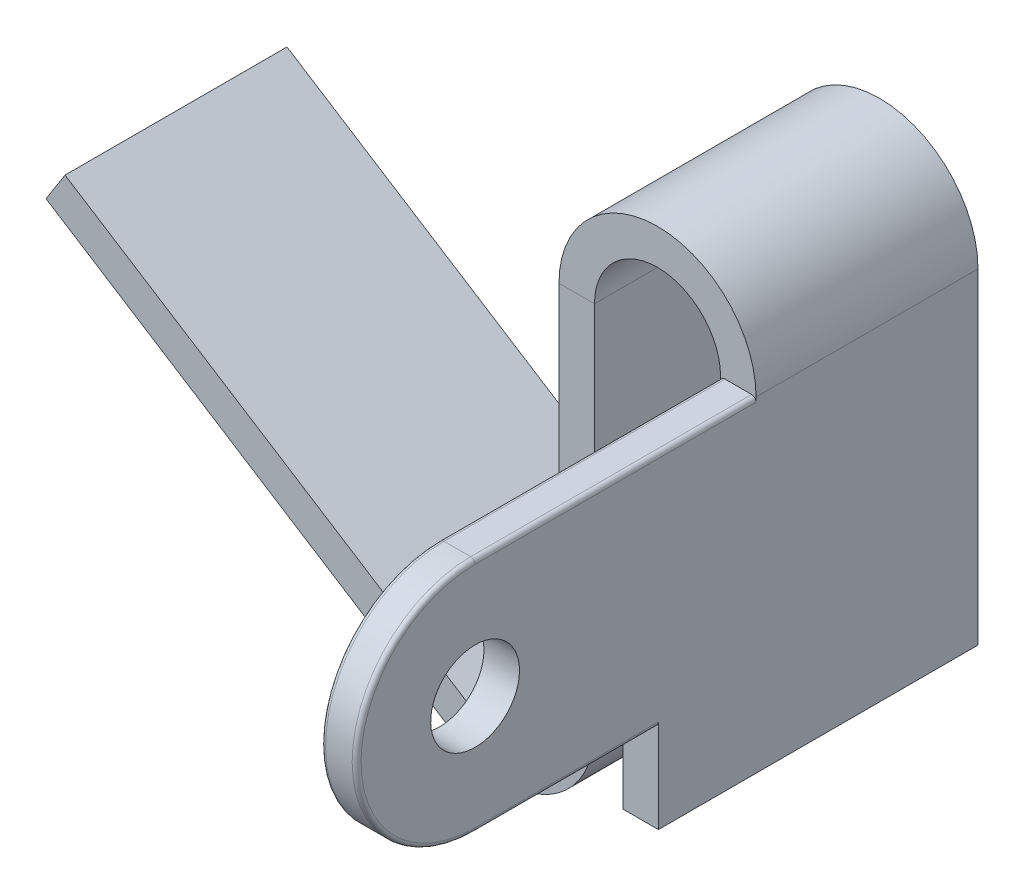
ISO-10303-21;
HEADER;
FILE_DESCRIPTION(('STEP AP214'),'2;1');
FILE_NAME('part.step','',(''),(''),'','','');
FILE_SCHEMA(('AUTOMOTIVE_DESIGN { 1 0 10303 214 1 1 1 1 }'));
ENDSEC;
DATA;
#1=APPLICATION_CONTEXT('core data for automotive mechanical design processes');
#2=APPLICATION_PROTOCOL_DEFINITION('international standard','automotive_design',2000,#1);
#3=PRODUCT_CONTEXT('',#1,'mechanical');
#4=PRODUCT('Part','Part','',(#3));
#5=PRODUCT_RELATED_PRODUCT_CATEGORY('part','',(#4));
#6=PRODUCT_DEFINITION_FORMATION('','',#4);
#7=PRODUCT_DEFINITION_CONTEXT('part definition',#1,'design');
#8=PRODUCT_DEFINITION('design','',#6,#7);
#9=PRODUCT_DEFINITION_SHAPE('','',#8);
#10=(LENGTH_UNIT() NAMED_UNIT(*) SI_UNIT(.MILLI.,.METRE.));
#11=(NAMED_UNIT(*) PLANE_ANGLE_UNIT() SI_UNIT($,.RADIAN.));
#12=(NAMED_UNIT(*) SI_UNIT($,.STERADIAN.) SOLID_ANGLE_UNIT());
#13=UNCERTAINTY_MEASURE_WITH_UNIT(LENGTH_MEASURE(1.E-05),#10,'distance_accuracy_value','');
#14=(GEOMETRIC_REPRESENTATION_CONTEXT(3) GLOBAL_UNCERTAINTY_ASSIGNED_CONTEXT((#13)) GLOBAL_UNIT_ASSIGNED_CONTEXT((#10,
#11,#12)) REPRESENTATION_CONTEXT('',''));
#15=CARTESIAN_POINT('',(0.,0.,0.));
#16=DIRECTION('',(0.,0.,1.));
#17=DIRECTION('',(1.,0.,0.));
#18=AXIS2_PLACEMENT_3D('',#15,#16,#17);
#19=CARTESIAN_POINT('',(-0.0766485027156681,0.0732980143033362,3.5723853161025));
#20=DIRECTION('',(1.,0.,0.));
#21=DIRECTION('',(0.,1.,0.));
#22=AXIS2_PLACEMENT_3D('',#19,#20,#21);
#23=CYLINDRICAL_SURFACE('',#22,0.594075);
#24=DIRECTION('',(-1.,0.,0.));
#25=VECTOR('',#24,1.);
#26=CARTESIAN_POINT('',(-0.254648502715668,-0.520776985696664,3.5723853161025));
#27=LINE('',#26,#25);
#28=CARTESIAN_POINT('',(-0.0988985027156681,-0.520776985696664,3.5723853161025));
#29=VERTEX_POINT('',#28);
#30=CARTESIAN_POINT('',(-0.232398502715668,-0.520776985696664,3.5723853161025));
#31=VERTEX_POINT('',#30);
#32=EDGE_CURVE('E245',#29,#31,#27,.T.);
#33=ORIENTED_EDGE('',*,*,#32,.F.);
#34=CARTESIAN_POINT('',(-0.0988985027156681,0.0732980143033362,3.5723853161025));
#35=DIRECTION('',(-1.,0.,0.));
#36=DIRECTION('',(0.,-1.,0.));
#37=AXIS2_PLACEMENT_3D('',#34,#35,#36);
#38=CIRCLE('',#37,0.594075);
#39=CARTESIAN_POINT('',(-0.0988985027156681,0.667373014303336,3.5723853161025));
#40=VERTEX_POINT('',#39);
#41=EDGE_CURVE('E278',#29,#40,#38,.T.);
#42=ORIENTED_EDGE('',*,*,#41,.T.);
#43=DIRECTION('',(-1.,0.,0.));
#44=VECTOR('',#43,1.);
#45=CARTESIAN_POINT('',(-0.0766485027156681,0.667373014303336,3.5723853161025));
#46=LINE('',#45,#44);
#47=CARTESIAN_POINT('',(-0.232398502715668,0.667373014303336,3.5723853161025));
#48=VERTEX_POINT('',#47);
#49=EDGE_CURVE('E248',#48,#40,#46,.F.);
#50=ORIENTED_EDGE('',*,*,#49,.F.);
#51=CARTESIAN_POINT('',(-0.232398502715668,0.0732980143033362,3.5723853161025));
#52=DIRECTION('',(-1.,0.,0.));
#53=DIRECTION('',(0.,-1.,0.));
#54=AXIS2_PLACEMENT_3D('',#51,#52,#53);
#55=CIRCLE('',#54,0.594075);
#56=EDGE_CURVE('E276',#48,#31,#55,.F.);
#57=ORIENTED_EDGE('',*,*,#56,.T.);
#58=EDGE_LOOP('',(#33,#42,#50,#57));
#59=FACE_BOUND('',#58,.T.);
#60=ADVANCED_FACE('F42',(#59),#23,.T.);
#61=CARTESIAN_POINT('',(-0.254648502715668,-0.965776985696664,2.1639603161025));
#62=DIRECTION('',(-1.,0.,0.));
#63=DIRECTION('',(0.,-1.,0.));
#64=AXIS2_PLACEMENT_3D('',#61,#62,#63);
#65=PLANE('',#64);
#66=CARTESIAN_POINT('',(-0.254648502715668,0.0732980143033362,3.5723853161025));
#67=DIRECTION('',(-1.,0.,0.));
#68=DIRECTION('',(0.,-1.,0.));
#69=AXIS2_PLACEMENT_3D('',#66,#67,#68);
#70=CIRCLE('',#69,0.2225);
#71=CARTESIAN_POINT('',(-0.254648502715668,-0.149201985696664,3.5723853161025));
#72=VERTEX_POINT('',#71);
#73=EDGE_CURVE('E299',#72,#72,#70,.F.);
#74=ORIENTED_EDGE('',*,*,#73,.T.);
#75=EDGE_LOOP('',(#74));
#76=FACE_BOUND('',#75,.T.);
#77=DIRECTION('',(0.,0.,-1.));
#78=VECTOR('',#77,1.);
#79=CARTESIAN_POINT('',(-0.254648502715668,0.645123014303336,2.1639603161025));
#80=LINE('',#79,#78);
#81=CARTESIAN_POINT('',(-0.254648502715668,0.645123014303336,3.5723853161025));
#82=VERTEX_POINT('',#81);
#83=CARTESIAN_POINT('',(-0.254648502715668,0.645123014303336,2.1639603161025));
#84=VERTEX_POINT('',#83);
#85=EDGE_CURVE('E269',#82,#84,#80,.T.);
#86=ORIENTED_EDGE('',*,*,#85,.T.);
#87=DIRECTION('',(0.,1.,0.));
#88=VECTOR('',#87,1.);
#89=CARTESIAN_POINT('',(-0.254648502715668,-0.965776985696664,2.1639603161025));
#90=LINE('',#89,#88);
#91=CARTESIAN_POINT('',(-0.254648502715668,0.667373014303336,2.1639603161025));
#92=VERTEX_POINT('',#91);
#93=EDGE_CURVE('E274',#84,#92,#90,.T.);
#94=ORIENTED_EDGE('',*,*,#93,.T.);
#95=DIRECTION('',(0.,0.,-1.));
#96=VECTOR('',#95,1.);
#97=CARTESIAN_POINT('',(-0.254648502715668,0.667373014303336,2.1639603161025));
#98=LINE('',#97,#96);
#99=CARTESIAN_POINT('',(-0.254648502715668,0.667373014303336,1.0514603161025));
#100=VERTEX_POINT('',#99);
#101=EDGE_CURVE('E206',#92,#100,#98,.T.);
#102=ORIENTED_EDGE('',*,*,#101,.T.);
#103=DIRECTION('',(0.,1.,0.));
#104=VECTOR('',#103,1.);
#105=CARTESIAN_POINT('',(-0.254648502715668,-0.965776985696664,1.0514603161025));
#106=LINE('',#105,#104);
#107=CARTESIAN_POINT('',(-0.254648502715668,-0.965776985696664,1.0514603161025));
#108=VERTEX_POINT('',#107);
#109=EDGE_CURVE('E354',#108,#100,#106,.T.);
#110=ORIENTED_EDGE('',*,*,#109,.F.);
#111=DIRECTION('',(0.,0.,-1.));
#112=VECTOR('',#111,1.);
#113=CARTESIAN_POINT('',(-0.254648502715668,-0.965776985696664,2.1639603161025));
#114=LINE('',#113,#112);
#115=CARTESIAN_POINT('',(-0.254648502715668,-0.965776985696664,2.6534603161025));
#116=VERTEX_POINT('',#115);
#117=EDGE_CURVE('E203',#116,#108,#114,.T.);
#118=ORIENTED_EDGE('',*,*,#117,.F.);
#119=DIRECTION('',(0.,-1.,0.));
#120=VECTOR('',#119,1.);
#121=CARTESIAN_POINT('',(-0.254648502715668,-0.965776985696664,2.6534603161025));
#122=LINE('',#121,#120);
#123=CARTESIAN_POINT('',(-0.254648502715668,-0.498526985696664,2.6534603161025));
#124=VERTEX_POINT('',#123);
#125=EDGE_CURVE('E67',#124,#116,#122,.T.);
#126=ORIENTED_EDGE('',*,*,#125,.F.);
#127=DIRECTION('',(0.,0.,1.));
#128=VECTOR('',#127,1.);
#129=CARTESIAN_POINT('',(-0.254648502715668,-0.498526985696664,2.1639603161025));
#130=LINE('',#129,#128);
#131=CARTESIAN_POINT('',(-0.254648502715668,-0.498526985696664,3.5723853161025));
#132=VERTEX_POINT('',#131);
#133=EDGE_CURVE('E272',#124,#132,#130,.T.);
#134=ORIENTED_EDGE('',*,*,#133,.T.);
#135=CARTESIAN_POINT('',(-0.254648502715668,0.0732980143033362,3.5723853161025));
#136=DIRECTION('',(-1.,0.,0.));
#137=DIRECTION('',(0.,-1.,0.));
#138=AXIS2_PLACEMENT_3D('',#135,#136,#137);
#139=CIRCLE('',#138,0.571825);
#140=EDGE_CURVE('E267',#132,#82,#139,.T.);
#141=ORIENTED_EDGE('',*,*,#140,.T.);
#142=EDGE_LOOP('',(#86,#94,#102,#110,#118,#126,#134,#141));
#143=FACE_BOUND('',#142,.T.);
#144=ADVANCED_FACE('F433',(#76,#143),#65,.T.);
#145=CARTESIAN_POINT('',(-0.0766485027156681,-0.965776985696664,2.1639603161025));
#146=DIRECTION('',(0.,-1.,0.));
#147=DIRECTION('',(0.,0.,-1.));
#148=AXIS2_PLACEMENT_3D('',#145,#146,#147);
#149=PLANE('',#148);
#150=DIRECTION('',(0.,0.,-1.));
#151=VECTOR('',#150,1.);
#152=CARTESIAN_POINT('',(-0.0766485027156681,-0.965776985696664,2.1639603161025));
#153=LINE('',#152,#151);
#154=CARTESIAN_POINT('',(-0.0766485027156681,-0.965776985696664,2.6534603161025));
#155=VERTEX_POINT('',#154);
#156=CARTESIAN_POINT('',(-0.0766485027156681,-0.965776985696664,1.0514603161025));
#157=VERTEX_POINT('',#156);
#158=EDGE_CURVE('E193',#155,#157,#153,.T.);
#159=ORIENTED_EDGE('',*,*,#158,.F.);
#160=DIRECTION('',(-1.,0.,0.));
#161=VECTOR('',#160,1.);
#162=CARTESIAN_POINT('',(-0.254648502715668,-0.965776985696664,2.6534603161025));
#163=LINE('',#162,#161);
#164=EDGE_CURVE('E180',#116,#155,#163,.F.);
#165=ORIENTED_EDGE('',*,*,#164,.F.);
#166=ORIENTED_EDGE('',*,*,#117,.T.);
#167=DIRECTION('',(-1.,0.,0.));
#168=VECTOR('',#167,1.);
#169=CARTESIAN_POINT('',(-0.0766485027156681,-0.965776985696664,1.0514603161025));
#170=LINE('',#169,#168);
#171=EDGE_CURVE('E202',#157,#108,#170,.T.);
#172=ORIENTED_EDGE('',*,*,#171,.F.);
#173=EDGE_LOOP('',(#159,#165,#166,#172));
#174=FACE_BOUND('',#173,.T.);
#175=ADVANCED_FACE('F200',(#174),#149,.T.);
#176=CARTESIAN_POINT('',(-0.0766485027156681,-0.965776985696664,2.1639603161025));
#177=DIRECTION('',(-1.,0.,0.));
#178=DIRECTION('',(0.,-1.,0.));
#179=AXIS2_PLACEMENT_3D('',#176,#177,#178);
#180=PLANE('',#179);
#181=CARTESIAN_POINT('',(-0.0766485027156681,0.0732980143033362,3.5723853161025));
#182=DIRECTION('',(1.,0.,0.));
#183=DIRECTION('',(0.,1.,0.));
#184=AXIS2_PLACEMENT_3D('',#181,#182,#183);
#185=CIRCLE('',#184,0.2225);
#186=CARTESIAN_POINT('',(-0.0766485027156681,0.295798014303337,3.5723853161025));
#187=VERTEX_POINT('',#186);
#188=EDGE_CURVE('E292',#187,#187,#185,.T.);
#189=ORIENTED_EDGE('',*,*,#188,.F.);
#190=EDGE_LOOP('',(#189));
#191=FACE_BOUND('',#190,.T.);
#192=DIRECTION('',(0.,0.,1.));
#193=VECTOR('',#192,1.);
#194=CARTESIAN_POINT('',(-0.0766485027156681,-0.498526985696664,2.6534603161025));
#195=LINE('',#194,#193);
#196=CARTESIAN_POINT('',(-0.0766485027156681,-0.498526985696664,3.5723853161025));
#197=VERTEX_POINT('',#196);
#198=CARTESIAN_POINT('',(-0.0766485027156681,-0.498526985696664,2.6534603161025));
#199=VERTEX_POINT('',#198);
#200=EDGE_CURVE('E196',#197,#199,#195,.F.);
#201=ORIENTED_EDGE('',*,*,#200,.T.);
#202=DIRECTION('',(0.,-1.,0.));
#203=VECTOR('',#202,1.);
#204=CARTESIAN_POINT('',(-0.0766485027156681,-0.965776985696664,2.6534603161025));
#205=LINE('',#204,#203);
#206=EDGE_CURVE('E184',#199,#155,#205,.T.);
#207=ORIENTED_EDGE('',*,*,#206,.T.);
#208=ORIENTED_EDGE('',*,*,#158,.T.);
#209=DIRECTION('',(0.,1.,0.));
#210=VECTOR('',#209,1.);
#211=CARTESIAN_POINT('',(-0.0766485027156681,-0.965776985696664,1.0514603161025));
#212=LINE('',#211,#210);
#213=CARTESIAN_POINT('',(-0.0766485027156682,0.667373014303336,1.0514603161025));
#214=VERTEX_POINT('',#213);
#215=EDGE_CURVE('E358',#157,#214,#212,.T.);
#216=ORIENTED_EDGE('',*,*,#215,.T.);
#217=DIRECTION('',(0.,0.,-1.));
#218=VECTOR('',#217,1.);
#219=CARTESIAN_POINT('',(-0.0766485027156682,0.667373014303336,2.1639603161025));
#220=LINE('',#219,#218);
#221=CARTESIAN_POINT('',(-0.0766485027156682,0.667373014303336,2.1639603161025));
#222=VERTEX_POINT('',#221);
#223=EDGE_CURVE('E204',#222,#214,#220,.T.);
#224=ORIENTED_EDGE('',*,*,#223,.F.);
#225=DIRECTION('',(0.,-1.,0.));
#226=VECTOR('',#225,1.);
#227=CARTESIAN_POINT('',(-0.0766485027156682,0.667373014303336,2.1639603161025));
#228=LINE('',#227,#226);
#229=CARTESIAN_POINT('',(-0.0766485027156681,0.645123014303336,2.1639603161025));
#230=VERTEX_POINT('',#229);
#231=EDGE_CURVE('E59',#222,#230,#228,.T.);
#232=ORIENTED_EDGE('',*,*,#231,.T.);
#233=DIRECTION('',(0.,0.,-1.));
#234=VECTOR('',#233,1.);
#235=CARTESIAN_POINT('',(-0.0766485027156681,0.645123014303336,2.1639603161025));
#236=LINE('',#235,#234);
#237=CARTESIAN_POINT('',(-0.0766485027156681,0.645123014303336,3.5723853161025));
#238=VERTEX_POINT('',#237);
#239=EDGE_CURVE('E259',#230,#238,#236,.F.);
#240=ORIENTED_EDGE('',*,*,#239,.T.);
#241=CARTESIAN_POINT('',(-0.0766485027156681,0.0732980143033362,3.5723853161025));
#242=DIRECTION('',(-1.,0.,0.));
#243=DIRECTION('',(0.,-1.,0.));
#244=AXIS2_PLACEMENT_3D('',#241,#242,#243);
#245=CIRCLE('',#244,0.571825);
#246=EDGE_CURVE('E256',#238,#197,#245,.F.);
#247=ORIENTED_EDGE('',*,*,#246,.T.);
#248=EDGE_LOOP('',(#201,#207,#208,#216,#224,#232,#240,#247));
#249=FACE_BOUND('',#248,.T.);
#250=ADVANCED_FACE('F191',(#191,#249),#180,.F.);
#251=CARTESIAN_POINT('',(-0.886548502715667,0.667373014303336,2.1639603161025));
#252=DIRECTION('',(0.,0.,1.));
#253=DIRECTION('',(1.,0.,0.));
#254=AXIS2_PLACEMENT_3D('',#251,#252,#253);
#255=PLANE('',#254);
#256=DIRECTION('',(-1.,0.,0.));
#257=VECTOR('',#256,1.);
#258=CARTESIAN_POINT('',(-0.886548502715667,0.667373014303336,2.1639603161025));
#259=LINE('',#258,#257);
#260=CARTESIAN_POINT('',(-0.886548502715667,0.667373014303336,2.1639603161025));
#261=VERTEX_POINT('',#260);
#262=CARTESIAN_POINT('',(-1.06454850271567,0.667373014303336,2.1639603161025));
#263=VERTEX_POINT('',#262);
#264=EDGE_CURVE('E243',#261,#263,#259,.T.);
#265=ORIENTED_EDGE('',*,*,#264,.F.);
#266=CARTESIAN_POINT('',(-0.570598502715668,0.667373014303336,2.1639603161025));
#267=DIRECTION('',(0.,0.,1.));
#268=DIRECTION('',(1.,0.,0.));
#269=AXIS2_PLACEMENT_3D('',#266,#267,#268);
#270=CIRCLE('',#269,0.31595);
#271=EDGE_CURVE('E325',#92,#261,#270,.T.);
#272=ORIENTED_EDGE('',*,*,#271,.F.);
#273=ORIENTED_EDGE('',*,*,#93,.F.);
#274=CARTESIAN_POINT('',(-0.232398502715668,0.645123014303336,2.1639603161025));
#275=DIRECTION('',(0.,0.,1.));
#276=DIRECTION('',(1.,0.,0.));
#277=AXIS2_PLACEMENT_3D('',#274,#275,#276);
#278=CIRCLE('',#277,0.02225);
#279=CARTESIAN_POINT('',(-0.232398502715668,0.667373014303336,2.1639603161025));
#280=VERTEX_POINT('',#279);
#281=EDGE_CURVE('E11',#84,#280,#278,.F.);
#282=ORIENTED_EDGE('',*,*,#281,.T.);
#283=DIRECTION('',(-1.,0.,0.));
#284=VECTOR('',#283,1.);
#285=CARTESIAN_POINT('',(-0.0766485027156682,0.667373014303336,2.1639603161025));
#286=LINE('',#285,#284);
#287=CARTESIAN_POINT('',(-0.0988985027156681,0.667373014303336,2.1639603161025));
#288=VERTEX_POINT('',#287);
#289=EDGE_CURVE('E240',#288,#280,#286,.T.);
#290=ORIENTED_EDGE('',*,*,#289,.F.);
#291=CARTESIAN_POINT('',(-0.0988985027156681,0.645123014303336,2.1639603161025));
#292=DIRECTION('',(0.,0.,1.));
#293=DIRECTION('',(1.,0.,0.));
#294=AXIS2_PLACEMENT_3D('',#291,#292,#293);
#295=CIRCLE('',#294,0.02225);
#296=EDGE_CURVE('E280',#288,#230,#295,.F.);
#297=ORIENTED_EDGE('',*,*,#296,.T.);
#298=ORIENTED_EDGE('',*,*,#231,.F.);
#299=CARTESIAN_POINT('',(-0.570598502715668,0.667373014303336,2.1639603161025));
#300=DIRECTION('',(0.,0.,1.));
#301=DIRECTION('',(1.,0.,0.));
#302=AXIS2_PLACEMENT_3D('',#299,#300,#301);
#303=CIRCLE('',#302,0.49395);
#304=EDGE_CURVE('E328',#222,#263,#303,.T.);
#305=ORIENTED_EDGE('',*,*,#304,.T.);
#306=EDGE_LOOP('',(#265,#272,#273,#282,#290,#297,#298,#305));
#307=FACE_BOUND('',#306,.T.);
#308=ADVANCED_FACE('F421',(#307),#255,.T.);
#309=CARTESIAN_POINT('',(-0.0766485027156682,0.667373014303336,2.1639603161025));
#310=DIRECTION('',(0.,0.,1.));
#311=DIRECTION('',(1.,0.,0.));
#312=AXIS2_PLACEMENT_3D('',#309,#310,#311);
#313=PLANE('',#312);
#314=DIRECTION('',(0.,-1.,0.));
#315=VECTOR('',#314,1.);
#316=CARTESIAN_POINT('',(-0.886548502715667,0.667373014303336,2.1639603161025));
#317=LINE('',#316,#315);
#318=CARTESIAN_POINT('',(-0.886548502715667,-1.18827698569666,2.1639603161025));
#319=VERTEX_POINT('',#318);
#320=EDGE_CURVE('E322',#261,#319,#317,.T.);
#321=ORIENTED_EDGE('',*,*,#320,.F.);
#322=ORIENTED_EDGE('',*,*,#264,.T.);
#323=DIRECTION('',(0.,-1.,0.));
#324=VECTOR('',#323,1.);
#325=CARTESIAN_POINT('',(-1.06454850271567,0.667373014303336,2.1639603161025));
#326=LINE('',#325,#324);
#327=CARTESIAN_POINT('',(-1.06454850271567,-1.18827698569666,2.1639603161025));
#328=VERTEX_POINT('',#327);
#329=EDGE_CURVE('E330',#263,#328,#326,.T.);
#330=ORIENTED_EDGE('',*,*,#329,.T.);
#331=DIRECTION('',(1.,0.,0.));
#332=VECTOR('',#331,1.);
#333=CARTESIAN_POINT('',(-1.06454850271567,-1.18827698569666,2.1639603161025));
#334=LINE('',#333,#332);
#335=EDGE_CURVE('E232',#328,#319,#334,.T.);
#336=ORIENTED_EDGE('',*,*,#335,.T.);
#337=EDGE_LOOP('',(#321,#322,#330,#336));
#338=FACE_BOUND('',#337,.T.);
#339=ADVANCED_FACE('F419',(#338),#313,.T.);
#340=CARTESIAN_POINT('',(-0.254648502715668,0.667373014303336,1.0514603161025));
#341=DIRECTION('',(0.,0.,-1.));
#342=DIRECTION('',(-1.,0.,0.));
#343=AXIS2_PLACEMENT_3D('',#340,#341,#342);
#344=PLANE('',#343);
#345=DIRECTION('',(1.,0.,0.));
#346=VECTOR('',#345,1.);
#347=CARTESIAN_POINT('',(-0.254648502715668,0.667373014303336,1.0514603161025));
#348=LINE('',#347,#346);
#349=EDGE_CURVE('E238',#100,#214,#348,.T.);
#350=ORIENTED_EDGE('',*,*,#349,.F.);
#351=CARTESIAN_POINT('',(-0.570598502715668,0.667373014303336,1.0514603161025));
#352=DIRECTION('',(0.,0.,1.));
#353=DIRECTION('',(1.,0.,0.));
#354=AXIS2_PLACEMENT_3D('',#351,#352,#353);
#355=CIRCLE('',#354,0.31595);
#356=CARTESIAN_POINT('',(-0.886548502715667,0.667373014303336,1.0514603161025));
#357=VERTEX_POINT('',#356);
#358=EDGE_CURVE('E351',#100,#357,#355,.T.);
#359=ORIENTED_EDGE('',*,*,#358,.T.);
#360=DIRECTION('',(1.,0.,0.));
#361=VECTOR('',#360,1.);
#362=CARTESIAN_POINT('',(-1.06454850271567,0.667373014303336,1.0514603161025));
#363=LINE('',#362,#361);
#364=CARTESIAN_POINT('',(-1.06454850271567,0.667373014303336,1.0514603161025));
#365=VERTEX_POINT('',#364);
#366=EDGE_CURVE('E236',#365,#357,#363,.T.);
#367=ORIENTED_EDGE('',*,*,#366,.F.);
#368=CARTESIAN_POINT('',(-0.570598502715668,0.667373014303336,1.0514603161025));
#369=DIRECTION('',(0.,0.,1.));
#370=DIRECTION('',(1.,0.,0.));
#371=AXIS2_PLACEMENT_3D('',#368,#369,#370);
#372=CIRCLE('',#371,0.49395);
#373=EDGE_CURVE('E360',#214,#365,#372,.T.);
#374=ORIENTED_EDGE('',*,*,#373,.F.);
#375=EDGE_LOOP('',(#350,#359,#367,#374));
#376=FACE_BOUND('',#375,.T.);
#377=ADVANCED_FACE('F425',(#376),#344,.T.);
#378=CARTESIAN_POINT('',(-1.06454850271567,0.667373014303336,1.0514603161025));
#379=DIRECTION('',(0.,0.,-1.));
#380=DIRECTION('',(-1.,0.,0.));
#381=AXIS2_PLACEMENT_3D('',#378,#379,#380);
#382=PLANE('',#381);
#383=ORIENTED_EDGE('',*,*,#109,.T.);
#384=ORIENTED_EDGE('',*,*,#349,.T.);
#385=ORIENTED_EDGE('',*,*,#215,.F.);
#386=ORIENTED_EDGE('',*,*,#171,.T.);
#387=EDGE_LOOP('',(#383,#384,#385,#386));
#388=FACE_BOUND('',#387,.T.);
#389=ADVANCED_FACE('F432',(#388),#382,.T.);
#390=CARTESIAN_POINT('',(-1.57018812342235,-1.56387801262413,2.1639603161025));
#391=DIRECTION('',(0.,0.,1.));
#392=DIRECTION('',(1.,0.,0.));
#393=AXIS2_PLACEMENT_3D('',#390,#391,#392);
#394=PLANE('',#393);
#395=DIRECTION('',(0.536268810576818,0.844047251522404,0.));
#396=VECTOR('',#395,1.);
#397=CARTESIAN_POINT('',(-1.57018812342235,-1.56387801262413,2.1639603161025));
#398=LINE('',#397,#396);
#399=CARTESIAN_POINT('',(-1.57018812342235,-1.56387801262413,2.1639603161025));
#400=VERTEX_POINT('',#399);
#401=CARTESIAN_POINT('',(-1.47473227513968,-1.41363760185315,2.1639603161025));
#402=VERTEX_POINT('',#401);
#403=EDGE_CURVE('E234',#400,#402,#398,.T.);
#404=ORIENTED_EDGE('',*,*,#403,.F.);
#405=CARTESIAN_POINT('',(-1.33154850271567,-1.18827698569666,2.1639603161025));
#406=DIRECTION('',(0.,0.,-1.));
#407=DIRECTION('',(-1.,0.,0.));
#408=AXIS2_PLACEMENT_3D('',#405,#406,#407);
#409=CIRCLE('',#408,0.445);
#410=EDGE_CURVE('E319',#319,#400,#409,.T.);
#411=ORIENTED_EDGE('',*,*,#410,.F.);
#412=ORIENTED_EDGE('',*,*,#335,.F.);
#413=CARTESIAN_POINT('',(-1.33154850271567,-1.18827698569666,2.1639603161025));
#414=DIRECTION('',(0.,0.,1.));
#415=DIRECTION('',(1.,0.,0.));
#416=AXIS2_PLACEMENT_3D('',#413,#414,#415);
#417=CIRCLE('',#416,0.267);
#418=EDGE_CURVE('E333',#328,#402,#417,.F.);
#419=ORIENTED_EDGE('',*,*,#418,.T.);
#420=EDGE_LOOP('',(#404,#411,#412,#419));
#421=FACE_BOUND('',#420,.T.);
#422=ADVANCED_FACE('F417',(#421),#394,.T.);
#423=CARTESIAN_POINT('',(-1.06454850271567,-1.18827698569666,2.1639603161025));
#424=DIRECTION('',(0.,0.,1.));
#425=DIRECTION('',(1.,0.,0.));
#426=AXIS2_PLACEMENT_3D('',#423,#424,#425);
#427=PLANE('',#426);
#428=DIRECTION('',(-0.844047251522404,0.536268810576819,0.));
#429=VECTOR('',#428,1.);
#430=CARTESIAN_POINT('',(-1.57018812342235,-1.56387801262413,2.1639603161025));
#431=LINE('',#430,#429);
#432=CARTESIAN_POINT('',(-3.63599377152343,-0.251360098737369,2.1639603161025));
#433=VERTEX_POINT('',#432);
#434=EDGE_CURVE('E316',#400,#433,#431,.T.);
#435=ORIENTED_EDGE('',*,*,#434,.F.);
#436=ORIENTED_EDGE('',*,*,#403,.T.);
#437=DIRECTION('',(-0.844047251522404,0.536268810576819,0.));
#438=VECTOR('',#437,1.);
#439=CARTESIAN_POINT('',(-1.47473227513968,-1.41363760185315,2.1639603161025));
#440=LINE('',#439,#438);
#441=CARTESIAN_POINT('',(-3.54053792324076,-0.101119687966381,2.1639603161025));
#442=VERTEX_POINT('',#441);
#443=EDGE_CURVE('E310',#402,#442,#440,.T.);
#444=ORIENTED_EDGE('',*,*,#443,.T.);
#445=DIRECTION('',(0.536268810576817,0.844047251522405,0.));
#446=VECTOR('',#445,1.);
#447=CARTESIAN_POINT('',(-3.63599377152343,-0.251360098737369,2.1639603161025));
#448=LINE('',#447,#446);
#449=EDGE_CURVE('E312',#433,#442,#448,.T.);
#450=ORIENTED_EDGE('',*,*,#449,.F.);
#451=EDGE_LOOP('',(#435,#436,#444,#450));
#452=FACE_BOUND('',#451,.T.);
#453=ADVANCED_FACE('F415',(#452),#427,.T.);
#454=CARTESIAN_POINT('',(-0.886548502715667,-1.18827698569666,1.0514603161025));
#455=DIRECTION('',(0.,0.,-1.));
#456=DIRECTION('',(-1.,0.,0.));
#457=AXIS2_PLACEMENT_3D('',#454,#455,#456);
#458=PLANE('',#457);
#459=DIRECTION('',(-1.,0.,0.));
#460=VECTOR('',#459,1.);
#461=CARTESIAN_POINT('',(-0.886548502715667,-1.18827698569666,1.0514603161025));
#462=LINE('',#461,#460);
#463=CARTESIAN_POINT('',(-0.886548502715667,-1.18827698569666,1.0514603161025));
#464=VERTEX_POINT('',#463);
#465=CARTESIAN_POINT('',(-1.06454850271567,-1.18827698569666,1.0514603161025));
#466=VERTEX_POINT('',#465);
#467=EDGE_CURVE('E230',#464,#466,#462,.T.);
#468=ORIENTED_EDGE('',*,*,#467,.F.);
#469=CARTESIAN_POINT('',(-1.33154850271567,-1.18827698569666,1.0514603161025));
#470=DIRECTION('',(0.,0.,-1.));
#471=DIRECTION('',(-1.,0.,0.));
#472=AXIS2_PLACEMENT_3D('',#469,#470,#471);
#473=CIRCLE('',#472,0.445);
#474=CARTESIAN_POINT('',(-1.57018812342235,-1.56387801262413,1.0514603161025));
#475=VERTEX_POINT('',#474);
#476=EDGE_CURVE('E345',#464,#475,#473,.T.);
#477=ORIENTED_EDGE('',*,*,#476,.T.);
#478=DIRECTION('',(-0.536268810576818,-0.844047251522404,0.));
#479=VECTOR('',#478,1.);
#480=CARTESIAN_POINT('',(-1.47473227513968,-1.41363760185315,1.0514603161025));
#481=LINE('',#480,#479);
#482=CARTESIAN_POINT('',(-1.47473227513968,-1.41363760185315,1.0514603161025));
#483=VERTEX_POINT('',#482);
#484=EDGE_CURVE('E228',#483,#475,#481,.T.);
#485=ORIENTED_EDGE('',*,*,#484,.F.);
#486=CARTESIAN_POINT('',(-1.33154850271567,-1.18827698569666,1.0514603161025));
#487=DIRECTION('',(0.,0.,1.));
#488=DIRECTION('',(1.,0.,0.));
#489=AXIS2_PLACEMENT_3D('',#486,#487,#488);
#490=CIRCLE('',#489,0.267);
#491=EDGE_CURVE('E313',#466,#483,#490,.F.);
#492=ORIENTED_EDGE('',*,*,#491,.F.);
#493=EDGE_LOOP('',(#468,#477,#485,#492));
#494=FACE_BOUND('',#493,.T.);
#495=ADVANCED_FACE('F386',(#494),#458,.T.);
#496=CARTESIAN_POINT('',(-1.47473227513968,-1.41363760185315,1.0514603161025));
#497=DIRECTION('',(0.,0.,-1.));
#498=DIRECTION('',(-1.,0.,0.));
#499=AXIS2_PLACEMENT_3D('',#496,#497,#498);
#500=PLANE('',#499);
#501=DIRECTION('',(0.,-1.,0.));
#502=VECTOR('',#501,1.);
#503=CARTESIAN_POINT('',(-0.886548502715667,0.667373014303336,1.0514603161025));
#504=LINE('',#503,#502);
#505=EDGE_CURVE('E348',#357,#464,#504,.T.);
#506=ORIENTED_EDGE('',*,*,#505,.T.);
#507=ORIENTED_EDGE('',*,*,#467,.T.);
#508=DIRECTION('',(0.,-1.,0.));
#509=VECTOR('',#508,1.);
#510=CARTESIAN_POINT('',(-1.06454850271567,0.667373014303336,1.0514603161025));
#511=LINE('',#510,#509);
#512=EDGE_CURVE('E363',#365,#466,#511,.T.);
#513=ORIENTED_EDGE('',*,*,#512,.F.);
#514=ORIENTED_EDGE('',*,*,#366,.T.);
#515=EDGE_LOOP('',(#506,#507,#513,#514));
#516=FACE_BOUND('',#515,.T.);
#517=ADVANCED_FACE('F382',(#516),#500,.T.);
#518=CARTESIAN_POINT('',(-1.47473227513968,-1.41363760185315,2.1639603161025));
#519=DIRECTION('',(-0.536268810576819,-0.844047251522404,0.));
#520=DIRECTION('',(0.844047251522404,-0.536268810576819,0.));
#521=AXIS2_PLACEMENT_3D('',#518,#519,#520);
#522=PLANE('',#521);
#523=DIRECTION('',(-0.844047251522404,0.536268810576819,0.));
#524=VECTOR('',#523,1.);
#525=CARTESIAN_POINT('',(-1.47473227513968,-1.41363760185315,1.0514603161025));
#526=LINE('',#525,#524);
#527=CARTESIAN_POINT('',(-3.54053792324076,-0.101119687966381,1.0514603161025));
#528=VERTEX_POINT('',#527);
#529=EDGE_CURVE('E309',#483,#528,#526,.T.);
#530=ORIENTED_EDGE('',*,*,#529,.T.);
#531=DIRECTION('',(0.,0.,-1.));
#532=VECTOR('',#531,1.);
#533=CARTESIAN_POINT('',(-3.54053792324076,-0.101119687966381,2.1639603161025));
#534=LINE('',#533,#532);
#535=EDGE_CURVE('E226',#442,#528,#534,.T.);
#536=ORIENTED_EDGE('',*,*,#535,.F.);
#537=ORIENTED_EDGE('',*,*,#443,.F.);
#538=DIRECTION('',(0.,0.,-1.));
#539=VECTOR('',#538,1.);
#540=CARTESIAN_POINT('',(-1.47473227513968,-1.41363760185315,2.1639603161025));
#541=LINE('',#540,#539);
#542=EDGE_CURVE('E336',#402,#483,#541,.T.);
#543=ORIENTED_EDGE('',*,*,#542,.T.);
#544=EDGE_LOOP('',(#530,#536,#537,#543));
#545=FACE_BOUND('',#544,.T.);
#546=ADVANCED_FACE('F411',(#545),#522,.F.);
#547=CARTESIAN_POINT('',(-3.63599377152343,-0.251360098737369,2.1639603161025));
#548=DIRECTION('',(-0.844047251522405,0.536268810576817,0.));
#549=DIRECTION('',(-0.536268810576817,-0.844047251522405,0.));
#550=AXIS2_PLACEMENT_3D('',#547,#548,#549);
#551=PLANE('',#550);
#552=DIRECTION('',(0.536268810576817,0.844047251522405,0.));
#553=VECTOR('',#552,1.);
#554=CARTESIAN_POINT('',(-3.63599377152343,-0.251360098737369,1.0514603161025));
#555=LINE('',#554,#553);
#556=CARTESIAN_POINT('',(-3.63599377152343,-0.251360098737369,1.0514603161025));
#557=VERTEX_POINT('',#556);
#558=EDGE_CURVE('E339',#557,#528,#555,.T.);
#559=ORIENTED_EDGE('',*,*,#558,.F.);
#560=DIRECTION('',(0.,0.,-1.));
#561=VECTOR('',#560,1.);
#562=CARTESIAN_POINT('',(-3.63599377152343,-0.251360098737369,2.1639603161025));
#563=LINE('',#562,#561);
#564=EDGE_CURVE('E224',#433,#557,#563,.T.);
#565=ORIENTED_EDGE('',*,*,#564,.F.);
#566=ORIENTED_EDGE('',*,*,#449,.T.);
#567=ORIENTED_EDGE('',*,*,#535,.T.);
#568=EDGE_LOOP('',(#559,#565,#566,#567));
#569=FACE_BOUND('',#568,.T.);
#570=ADVANCED_FACE('F497',(#569),#551,.T.);
#571=CARTESIAN_POINT('',(-1.57018812342235,-1.56387801262413,2.1639603161025));
#572=DIRECTION('',(-0.536268810576819,-0.844047251522404,0.));
#573=DIRECTION('',(0.844047251522404,-0.536268810576819,0.));
#574=AXIS2_PLACEMENT_3D('',#571,#572,#573);
#575=PLANE('',#574);
#576=DIRECTION('',(-0.844047251522404,0.536268810576819,0.));
#577=VECTOR('',#576,1.);
#578=CARTESIAN_POINT('',(-1.57018812342235,-1.56387801262413,1.0514603161025));
#579=LINE('',#578,#577);
#580=EDGE_CURVE('E342',#475,#557,#579,.T.);
#581=ORIENTED_EDGE('',*,*,#580,.F.);
#582=DIRECTION('',(0.,0.,-1.));
#583=VECTOR('',#582,1.);
#584=CARTESIAN_POINT('',(-1.57018812342235,-1.56387801262413,2.1639603161025));
#585=LINE('',#584,#583);
#586=EDGE_CURVE('E221',#400,#475,#585,.T.);
#587=ORIENTED_EDGE('',*,*,#586,.F.);
#588=ORIENTED_EDGE('',*,*,#434,.T.);
#589=ORIENTED_EDGE('',*,*,#564,.T.);
#590=EDGE_LOOP('',(#581,#587,#588,#589));
#591=FACE_BOUND('',#590,.T.);
#592=ADVANCED_FACE('F400',(#591),#575,.T.);
#593=CARTESIAN_POINT('',(-1.33154850271567,-1.18827698569666,2.1639603161025));
#594=DIRECTION('',(0.,0.,-1.));
#595=DIRECTION('',(-1.,0.,0.));
#596=AXIS2_PLACEMENT_3D('',#593,#594,#595);
#597=CYLINDRICAL_SURFACE('',#596,0.445);
#598=ORIENTED_EDGE('',*,*,#476,.F.);
#599=DIRECTION('',(0.,0.,-1.));
#600=VECTOR('',#599,1.);
#601=CARTESIAN_POINT('',(-0.886548502715667,-1.18827698569666,2.1639603161025));
#602=LINE('',#601,#600);
#603=EDGE_CURVE('E218',#319,#464,#602,.T.);
#604=ORIENTED_EDGE('',*,*,#603,.F.);
#605=ORIENTED_EDGE('',*,*,#410,.T.);
#606=ORIENTED_EDGE('',*,*,#586,.T.);
#607=EDGE_LOOP('',(#598,#604,#605,#606));
#608=FACE_BOUND('',#607,.T.);
#609=ADVANCED_FACE('F395',(#608),#597,.T.);
#610=CARTESIAN_POINT('',(-0.886548502715667,0.667373014303336,2.1639603161025));
#611=DIRECTION('',(1.,0.,0.));
#612=DIRECTION('',(0.,1.,0.));
#613=AXIS2_PLACEMENT_3D('',#610,#611,#612);
#614=PLANE('',#613);
#615=ORIENTED_EDGE('',*,*,#505,.F.);
#616=DIRECTION('',(0.,0.,-1.));
#617=VECTOR('',#616,1.);
#618=CARTESIAN_POINT('',(-0.886548502715667,0.667373014303336,2.1639603161025));
#619=LINE('',#618,#617);
#620=EDGE_CURVE('E215',#261,#357,#619,.T.);
#621=ORIENTED_EDGE('',*,*,#620,.F.);
#622=ORIENTED_EDGE('',*,*,#320,.T.);
#623=ORIENTED_EDGE('',*,*,#603,.T.);
#624=EDGE_LOOP('',(#615,#621,#622,#623));
#625=FACE_BOUND('',#624,.T.);
#626=ADVANCED_FACE('F390',(#625),#614,.T.);
#627=CARTESIAN_POINT('',(-0.570598502715668,0.667373014303336,2.1639603161025));
#628=DIRECTION('',(0.,0.,-1.));
#629=DIRECTION('',(-1.,0.,0.));
#630=AXIS2_PLACEMENT_3D('',#627,#628,#629);
#631=CYLINDRICAL_SURFACE('',#630,0.31595);
#632=ORIENTED_EDGE('',*,*,#358,.F.);
#633=ORIENTED_EDGE('',*,*,#101,.F.);
#634=ORIENTED_EDGE('',*,*,#271,.T.);
#635=ORIENTED_EDGE('',*,*,#620,.T.);
#636=EDGE_LOOP('',(#632,#633,#634,#635));
#637=FACE_BOUND('',#636,.T.);
#638=ADVANCED_FACE('F429',(#637),#631,.F.);
#639=CARTESIAN_POINT('',(-0.570598502715668,0.667373014303336,2.1639603161025));
#640=DIRECTION('',(0.,0.,-1.));
#641=DIRECTION('',(-1.,0.,0.));
#642=AXIS2_PLACEMENT_3D('',#639,#640,#641);
#643=CYLINDRICAL_SURFACE('',#642,0.49395);
#644=ORIENTED_EDGE('',*,*,#373,.T.);
#645=DIRECTION('',(0.,0.,-1.));
#646=VECTOR('',#645,1.);
#647=CARTESIAN_POINT('',(-1.06454850271567,0.667373014303336,2.1639603161025));
#648=LINE('',#647,#646);
#649=EDGE_CURVE('E209',#263,#365,#648,.T.);
#650=ORIENTED_EDGE('',*,*,#649,.F.);
#651=ORIENTED_EDGE('',*,*,#304,.F.);
#652=ORIENTED_EDGE('',*,*,#223,.T.);
#653=EDGE_LOOP('',(#644,#650,#651,#652));
#654=FACE_BOUND('',#653,.T.);
#655=ADVANCED_FACE('F422',(#654),#643,.T.);
#656=CARTESIAN_POINT('',(-1.06454850271567,0.667373014303336,2.1639603161025));
#657=DIRECTION('',(1.,0.,0.));
#658=DIRECTION('',(0.,1.,0.));
#659=AXIS2_PLACEMENT_3D('',#656,#657,#658);
#660=PLANE('',#659);
#661=ORIENTED_EDGE('',*,*,#512,.T.);
#662=DIRECTION('',(0.,0.,-1.));
#663=VECTOR('',#662,1.);
#664=CARTESIAN_POINT('',(-1.06454850271567,-1.18827698569666,2.1639603161025));
#665=LINE('',#664,#663);
#666=EDGE_CURVE('E370',#328,#466,#665,.T.);
#667=ORIENTED_EDGE('',*,*,#666,.F.);
#668=ORIENTED_EDGE('',*,*,#329,.F.);
#669=ORIENTED_EDGE('',*,*,#649,.T.);
#670=EDGE_LOOP('',(#661,#667,#668,#669));
#671=FACE_BOUND('',#670,.T.);
#672=ADVANCED_FACE('F377',(#671),#660,.F.);
#673=CARTESIAN_POINT('',(-1.33154850271567,-1.18827698569666,2.1639603161025));
#674=DIRECTION('',(0.,0.,-1.));
#675=DIRECTION('',(-1.,0.,0.));
#676=AXIS2_PLACEMENT_3D('',#673,#674,#675);
#677=CYLINDRICAL_SURFACE('',#676,0.267);
#678=ORIENTED_EDGE('',*,*,#491,.T.);
#679=ORIENTED_EDGE('',*,*,#542,.F.);
#680=ORIENTED_EDGE('',*,*,#418,.F.);
#681=ORIENTED_EDGE('',*,*,#666,.T.);
#682=EDGE_LOOP('',(#678,#679,#680,#681));
#683=FACE_BOUND('',#682,.T.);
#684=ADVANCED_FACE('F407',(#683),#677,.F.);
#685=CARTESIAN_POINT('',(-1.33154850271567,-1.18827698569666,1.0514603161025));
#686=DIRECTION('',(0.,0.,-1.));
#687=DIRECTION('',(-1.,0.,0.));
#688=AXIS2_PLACEMENT_3D('',#685,#686,#687);
#689=PLANE('',#688);
#690=ORIENTED_EDGE('',*,*,#529,.F.);
#691=ORIENTED_EDGE('',*,*,#484,.T.);
#692=ORIENTED_EDGE('',*,*,#580,.T.);
#693=ORIENTED_EDGE('',*,*,#558,.T.);
#694=EDGE_LOOP('',(#690,#691,#692,#693));
#695=FACE_BOUND('',#694,.T.);
#696=ADVANCED_FACE('F404',(#695),#689,.T.);
#697=CARTESIAN_POINT('',(-0.0766485027156682,0.667373014303336,4.1664603161025));
#698=DIRECTION('',(0.,-1.,0.));
#699=DIRECTION('',(0.,0.,-1.));
#700=AXIS2_PLACEMENT_3D('',#697,#698,#699);
#701=PLANE('',#700);
#702=ORIENTED_EDGE('',*,*,#49,.T.);
#703=DIRECTION('',(0.,0.,-1.));
#704=VECTOR('',#703,1.);
#705=CARTESIAN_POINT('',(-0.0988985027156681,0.667373014303336,4.1664603161025));
#706=LINE('',#705,#704);
#707=EDGE_CURVE('E253',#40,#288,#706,.T.);
#708=ORIENTED_EDGE('',*,*,#707,.T.);
#709=ORIENTED_EDGE('',*,*,#289,.T.);
#710=DIRECTION('',(0.,0.,-1.));
#711=VECTOR('',#710,1.);
#712=CARTESIAN_POINT('',(-0.232398502715668,0.667373014303336,3.5723853161025));
#713=LINE('',#712,#711);
#714=EDGE_CURVE('E251',#280,#48,#713,.F.);
#715=ORIENTED_EDGE('',*,*,#714,.T.);
#716=EDGE_LOOP('',(#702,#708,#709,#715));
#717=FACE_BOUND('',#716,.T.);
#718=ADVANCED_FACE('F440',(#717),#701,.F.);
#719=CARTESIAN_POINT('',(-0.254648502715668,-0.965776985696664,2.6534603161025));
#720=DIRECTION('',(0.,0.,-1.));
#721=DIRECTION('',(0.,-1.,0.));
#722=AXIS2_PLACEMENT_3D('',#719,#720,#721);
#723=PLANE('',#722);
#724=DIRECTION('',(-1.,0.,0.));
#725=VECTOR('',#724,1.);
#726=CARTESIAN_POINT('',(-0.254648502715668,-0.520776985696664,2.6534603161025));
#727=LINE('',#726,#725);
#728=CARTESIAN_POINT('',(-0.232398502715668,-0.520776985696664,2.6534603161025));
#729=VERTEX_POINT('',#728);
#730=CARTESIAN_POINT('',(-0.0988985027156681,-0.520776985696664,2.6534603161025));
#731=VERTEX_POINT('',#730);
#732=EDGE_CURVE('E188',#729,#731,#727,.F.);
#733=ORIENTED_EDGE('',*,*,#732,.F.);
#734=CARTESIAN_POINT('',(-0.232398502715668,-0.498526985696664,2.6534603161025));
#735=DIRECTION('',(0.,0.,-1.));
#736=DIRECTION('',(-1.,0.,0.));
#737=AXIS2_PLACEMENT_3D('',#734,#735,#736);
#738=CIRCLE('',#737,0.02225);
#739=EDGE_CURVE('E51',#729,#124,#738,.T.);
#740=ORIENTED_EDGE('',*,*,#739,.T.);
#741=ORIENTED_EDGE('',*,*,#125,.T.);
#742=ORIENTED_EDGE('',*,*,#164,.T.);
#743=ORIENTED_EDGE('',*,*,#206,.F.);
#744=CARTESIAN_POINT('',(-0.0988985027156681,-0.498526985696664,2.6534603161025));
#745=DIRECTION('',(0.,0.,-1.));
#746=DIRECTION('',(-1.,0.,0.));
#747=AXIS2_PLACEMENT_3D('',#744,#745,#746);
#748=CIRCLE('',#747,0.02225);
#749=EDGE_CURVE('E282',#199,#731,#748,.T.);
#750=ORIENTED_EDGE('',*,*,#749,.T.);
#751=EDGE_LOOP('',(#733,#740,#741,#742,#743,#750));
#752=FACE_BOUND('',#751,.T.);
#753=ADVANCED_FACE('F183',(#752),#723,.F.);
#754=CARTESIAN_POINT('',(-0.254648502715668,-0.520776985696664,2.1639603161025));
#755=DIRECTION('',(0.,1.,0.));
#756=DIRECTION('',(0.,0.,-1.));
#757=AXIS2_PLACEMENT_3D('',#754,#755,#756);
#758=PLANE('',#757);
#759=ORIENTED_EDGE('',*,*,#732,.T.);
#760=DIRECTION('',(0.,0.,-1.));
#761=VECTOR('',#760,1.);
#762=CARTESIAN_POINT('',(-0.0988985027156681,-0.520776985696664,3.5723853161025));
#763=LINE('',#762,#761);
#764=EDGE_CURVE('E265',#731,#29,#763,.F.);
#765=ORIENTED_EDGE('',*,*,#764,.T.);
#766=ORIENTED_EDGE('',*,*,#32,.T.);
#767=DIRECTION('',(0.,0.,-1.));
#768=VECTOR('',#767,1.);
#769=CARTESIAN_POINT('',(-0.232398502715668,-0.520776985696664,2.1639603161025));
#770=LINE('',#769,#768);
#771=EDGE_CURVE('E262',#31,#729,#770,.T.);
#772=ORIENTED_EDGE('',*,*,#771,.T.);
#773=EDGE_LOOP('',(#759,#765,#766,#772));
#774=FACE_BOUND('',#773,.T.);
#775=ADVANCED_FACE('F452',(#774),#758,.F.);
#776=CARTESIAN_POINT('',(-0.0988985027156681,-0.498526985696664,2.1639603161025));
#777=DIRECTION('',(0.,0.,-1.));
#778=DIRECTION('',(-1.,0.,0.));
#779=AXIS2_PLACEMENT_3D('',#776,#777,#778);
#780=CYLINDRICAL_SURFACE('',#779,0.02225);
#781=ORIENTED_EDGE('',*,*,#749,.F.);
#782=ORIENTED_EDGE('',*,*,#200,.F.);
#783=CARTESIAN_POINT('',(-0.0988985027156681,-0.498526985696664,3.5723853161025));
#784=DIRECTION('',(0.,0.,1.));
#785=DIRECTION('',(1.,0.,0.));
#786=AXIS2_PLACEMENT_3D('',#783,#784,#785);
#787=CIRCLE('',#786,0.02225);
#788=EDGE_CURVE('E288',#29,#197,#787,.T.);
#789=ORIENTED_EDGE('',*,*,#788,.F.);
#790=ORIENTED_EDGE('',*,*,#764,.F.);
#791=EDGE_LOOP('',(#781,#782,#789,#790));
#792=FACE_BOUND('',#791,.T.);
#793=ADVANCED_FACE('F455',(#792),#780,.T.);
#794=CARTESIAN_POINT('',(-0.0988985027156681,0.0732980143033362,3.5723853161025));
#795=DIRECTION('',(-1.,0.,0.));
#796=DIRECTION('',(0.,-1.,0.));
#797=AXIS2_PLACEMENT_3D('',#794,#795,#796);
#798=TOROIDAL_SURFACE('',#797,0.571825,0.02225);
#799=ORIENTED_EDGE('',*,*,#788,.T.);
#800=ORIENTED_EDGE('',*,*,#246,.F.);
#801=CARTESIAN_POINT('',(-0.0988985027156681,0.645123014303336,3.5723853161025));
#802=DIRECTION('',(0.,0.,-1.));
#803=DIRECTION('',(-1.,0.,0.));
#804=AXIS2_PLACEMENT_3D('',#801,#802,#803);
#805=CIRCLE('',#804,0.02225);
#806=EDGE_CURVE('E285',#40,#238,#805,.T.);
#807=ORIENTED_EDGE('',*,*,#806,.F.);
#808=ORIENTED_EDGE('',*,*,#41,.F.);
#809=EDGE_LOOP('',(#799,#800,#807,#808));
#810=FACE_BOUND('',#809,.T.);
#811=ADVANCED_FACE('F460',(#810),#798,.T.);
#812=CARTESIAN_POINT('',(-0.0988985027156681,0.645123014303336,4.1664603161025));
#813=DIRECTION('',(0.,0.,-1.));
#814=DIRECTION('',(-1.,0.,0.));
#815=AXIS2_PLACEMENT_3D('',#812,#813,#814);
#816=CYLINDRICAL_SURFACE('',#815,0.02225);
#817=ORIENTED_EDGE('',*,*,#806,.T.);
#818=ORIENTED_EDGE('',*,*,#239,.F.);
#819=ORIENTED_EDGE('',*,*,#296,.F.);
#820=ORIENTED_EDGE('',*,*,#707,.F.);
#821=EDGE_LOOP('',(#817,#818,#819,#820));
#822=FACE_BOUND('',#821,.T.);
#823=ADVANCED_FACE('F463',(#822),#816,.T.);
#824=CARTESIAN_POINT('',(-0.232398502715668,0.645123014303336,2.1639603161025));
#825=DIRECTION('',(0.,0.,1.));
#826=DIRECTION('',(1.,0.,0.));
#827=AXIS2_PLACEMENT_3D('',#824,#825,#826);
#828=CYLINDRICAL_SURFACE('',#827,0.02225);
#829=ORIENTED_EDGE('',*,*,#281,.F.);
#830=ORIENTED_EDGE('',*,*,#85,.F.);
#831=CARTESIAN_POINT('',(-0.232398502715668,0.645123014303336,3.5723853161025));
#832=DIRECTION('',(0.,0.,1.));
#833=DIRECTION('',(1.,0.,0.));
#834=AXIS2_PLACEMENT_3D('',#831,#832,#833);
#835=CIRCLE('',#834,0.02225);
#836=EDGE_CURVE('E46',#48,#82,#835,.T.);
#837=ORIENTED_EDGE('',*,*,#836,.F.);
#838=ORIENTED_EDGE('',*,*,#714,.F.);
#839=EDGE_LOOP('',(#829,#830,#837,#838));
#840=FACE_BOUND('',#839,.T.);
#841=ADVANCED_FACE('F44',(#840),#828,.T.);
#842=CARTESIAN_POINT('',(-0.232398502715668,0.0732980143033362,3.5723853161025));
#843=DIRECTION('',(-1.,0.,0.));
#844=DIRECTION('',(0.,-1.,0.));
#845=AXIS2_PLACEMENT_3D('',#842,#843,#844);
#846=TOROIDAL_SURFACE('',#845,0.571825,0.02225);
#847=ORIENTED_EDGE('',*,*,#836,.T.);
#848=ORIENTED_EDGE('',*,*,#140,.F.);
#849=CARTESIAN_POINT('',(-0.232398502715668,-0.498526985696664,3.5723853161025));
#850=DIRECTION('',(0.,0.,-1.));
#851=DIRECTION('',(-1.,0.,0.));
#852=AXIS2_PLACEMENT_3D('',#849,#850,#851);
#853=CIRCLE('',#852,0.02225);
#854=EDGE_CURVE('E290',#31,#132,#853,.T.);
#855=ORIENTED_EDGE('',*,*,#854,.F.);
#856=ORIENTED_EDGE('',*,*,#56,.F.);
#857=EDGE_LOOP('',(#847,#848,#855,#856));
#858=FACE_BOUND('',#857,.T.);
#859=ADVANCED_FACE('F447',(#858),#846,.T.);
#860=CARTESIAN_POINT('',(-0.232398502715668,-0.498526985696664,2.1639603161025));
#861=DIRECTION('',(0.,0.,1.));
#862=DIRECTION('',(1.,0.,0.));
#863=AXIS2_PLACEMENT_3D('',#860,#861,#862);
#864=CYLINDRICAL_SURFACE('',#863,0.02225);
#865=ORIENTED_EDGE('',*,*,#854,.T.);
#866=ORIENTED_EDGE('',*,*,#133,.F.);
#867=ORIENTED_EDGE('',*,*,#739,.F.);
#868=ORIENTED_EDGE('',*,*,#771,.F.);
#869=EDGE_LOOP('',(#865,#866,#867,#868));
#870=FACE_BOUND('',#869,.T.);
#871=ADVANCED_FACE('F530',(#870),#864,.T.);
#872=CARTESIAN_POINT('',(-3.63643877152343,0.0732980143033361,3.5723853161025));
#873=DIRECTION('',(1.,0.,0.));
#874=DIRECTION('',(0.,1.,0.));
#875=AXIS2_PLACEMENT_3D('',#872,#873,#874);
#876=CYLINDRICAL_SURFACE('',#875,0.2225);
#877=ORIENTED_EDGE('',*,*,#73,.F.);
#878=EDGE_LOOP('',(#877));
#879=FACE_BOUND('',#878,.T.);
#880=ORIENTED_EDGE('',*,*,#188,.T.);
#881=EDGE_LOOP('',(#880));
#882=FACE_BOUND('',#881,.T.);
#883=ADVANCED_FACE('F528',(#879,#882),#876,.F.);
#884=CLOSED_SHELL('',(#60,#144,#175,#250,#308,#339,#377,#389,#422,#453,#495,#517,#546,#570,#592,
#609,#626,#638,#655,#672,#684,#696,#718,#753,#775,#793,#811,#823,#841,#859,#871,#883));
#885=MANIFOLD_SOLID_BREP('B2',#884);
#886=ADVANCED_BREP_SHAPE_REPRESENTATION('',(#18,#885),#14);
#887=SHAPE_DEFINITION_REPRESENTATION(#9,#886);
ENDSEC;
END-ISO-10303-21;
